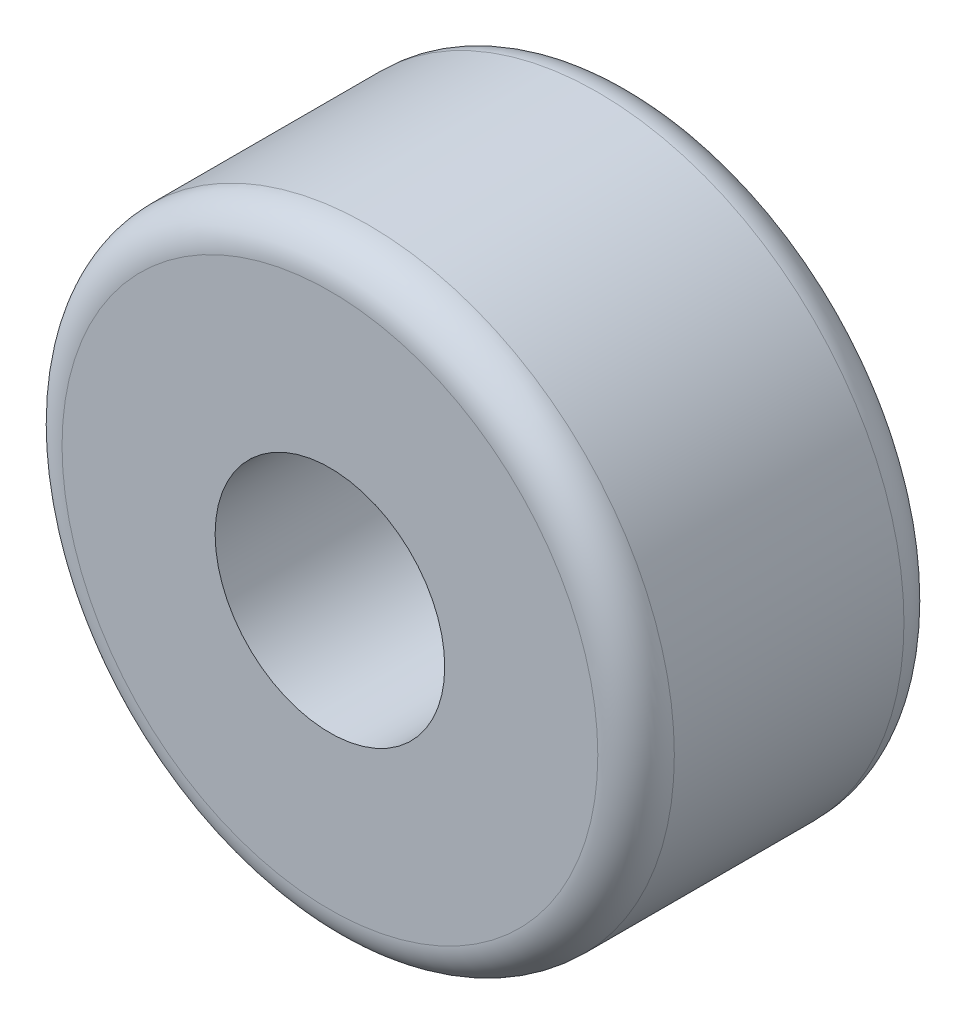
ISO-10303-21;
HEADER;
FILE_DESCRIPTION(('STEP AP214'),'2;1');
FILE_NAME('part.step','',(''),(''),'','','');
FILE_SCHEMA(('AUTOMOTIVE_DESIGN { 1 0 10303 214 1 1 1 1 }'));
ENDSEC;
DATA;
#1=APPLICATION_CONTEXT('core data for automotive mechanical design processes');
#2=APPLICATION_PROTOCOL_DEFINITION('international standard','automotive_design',2000,#1);
#3=PRODUCT_CONTEXT('',#1,'mechanical');
#4=PRODUCT('Part','Part','',(#3));
#5=PRODUCT_RELATED_PRODUCT_CATEGORY('part','',(#4));
#6=PRODUCT_DEFINITION_FORMATION('','',#4);
#7=PRODUCT_DEFINITION_CONTEXT('part definition',#1,'design');
#8=PRODUCT_DEFINITION('design','',#6,#7);
#9=PRODUCT_DEFINITION_SHAPE('','',#8);
#10=(LENGTH_UNIT() NAMED_UNIT(*) SI_UNIT(.MILLI.,.METRE.));
#11=(NAMED_UNIT(*) PLANE_ANGLE_UNIT() SI_UNIT($,.RADIAN.));
#12=(NAMED_UNIT(*) SI_UNIT($,.STERADIAN.) SOLID_ANGLE_UNIT());
#13=UNCERTAINTY_MEASURE_WITH_UNIT(LENGTH_MEASURE(1.E-05),#10,'distance_accuracy_value','');
#14=(GEOMETRIC_REPRESENTATION_CONTEXT(3) GLOBAL_UNCERTAINTY_ASSIGNED_CONTEXT((#13)) GLOBAL_UNIT_ASSIGNED_CONTEXT((#10,
#11,#12)) REPRESENTATION_CONTEXT('',''));
#15=CARTESIAN_POINT('',(0.,0.,0.));
#16=DIRECTION('',(0.,0.,1.));
#17=DIRECTION('',(1.,0.,0.));
#18=AXIS2_PLACEMENT_3D('',#15,#16,#17);
#19=CARTESIAN_POINT('',(0.028728990629815,0.0336525416927007,8.));
#20=DIRECTION('',(0.,0.,1.));
#21=DIRECTION('',(1.,0.,0.));
#22=AXIS2_PLACEMENT_3D('',#19,#20,#21);
#23=PLANE('',#22);
#24=CARTESIAN_POINT('',(0.028728990629815,0.0336525416927007,8.));
#25=DIRECTION('',(0.,0.,1.));
#26=DIRECTION('',(1.,0.,0.));
#27=AXIS2_PLACEMENT_3D('',#24,#25,#26);
#28=CIRCLE('',#27,7.);
#29=CARTESIAN_POINT('',(7.02872899062981,0.0336525416927007,8.));
#30=VERTEX_POINT('',#29);
#31=EDGE_CURVE('E10',#30,#30,#28,.T.);
#32=ORIENTED_EDGE('',*,*,#31,.T.);
#33=EDGE_LOOP('',(#32));
#34=FACE_BOUND('',#33,.T.);
#35=CARTESIAN_POINT('',(0.028728990629815,0.0336525416927007,8.));
#36=DIRECTION('',(0.,0.,1.));
#37=DIRECTION('',(1.,0.,0.));
#38=AXIS2_PLACEMENT_3D('',#35,#36,#37);
#39=CIRCLE('',#38,3.);
#40=CARTESIAN_POINT('',(3.02872899062982,0.0336525416927007,8.));
#41=VERTEX_POINT('',#40);
#42=EDGE_CURVE('E51',#41,#41,#39,.T.);
#43=ORIENTED_EDGE('',*,*,#42,.F.);
#44=EDGE_LOOP('',(#43));
#45=FACE_BOUND('',#44,.T.);
#46=ADVANCED_FACE('F31',(#34,#45),#23,.T.);
#47=CARTESIAN_POINT('',(0.028728990629815,0.0336525416927007,0.));
#48=DIRECTION('',(0.,0.,1.));
#49=DIRECTION('',(1.,0.,0.));
#50=AXIS2_PLACEMENT_3D('',#47,#48,#49);
#51=PLANE('',#50);
#52=CARTESIAN_POINT('',(0.028728990629815,0.0336525416927007,0.));
#53=DIRECTION('',(0.,0.,1.));
#54=DIRECTION('',(1.,0.,0.));
#55=AXIS2_PLACEMENT_3D('',#52,#53,#54);
#56=CIRCLE('',#55,7.);
#57=CARTESIAN_POINT('',(7.02872899062981,0.0336525416927007,0.));
#58=VERTEX_POINT('',#57);
#59=EDGE_CURVE('E38',#58,#58,#56,.F.);
#60=ORIENTED_EDGE('',*,*,#59,.T.);
#61=EDGE_LOOP('',(#60));
#62=FACE_BOUND('',#61,.T.);
#63=CARTESIAN_POINT('',(0.028728990629815,0.0336525416927007,0.));
#64=DIRECTION('',(0.,0.,1.));
#65=DIRECTION('',(1.,0.,0.));
#66=AXIS2_PLACEMENT_3D('',#63,#64,#65);
#67=CIRCLE('',#66,3.);
#68=CARTESIAN_POINT('',(3.02872899062982,0.0336525416927007,0.));
#69=VERTEX_POINT('',#68);
#70=EDGE_CURVE('E52',#69,#69,#67,.T.);
#71=ORIENTED_EDGE('',*,*,#70,.T.);
#72=EDGE_LOOP('',(#71));
#73=FACE_BOUND('',#72,.T.);
#74=ADVANCED_FACE('F62',(#62,#73),#51,.F.);
#75=CARTESIAN_POINT('',(0.028728990629815,0.0336525416927007,8.));
#76=DIRECTION('',(0.,0.,-1.));
#77=DIRECTION('',(-1.,0.,0.));
#78=AXIS2_PLACEMENT_3D('',#75,#76,#77);
#79=CYLINDRICAL_SURFACE('',#78,8.);
#80=CARTESIAN_POINT('',(0.028728990629815,0.0336525416927007,1.));
#81=DIRECTION('',(0.,0.,1.));
#82=DIRECTION('',(1.,0.,0.));
#83=AXIS2_PLACEMENT_3D('',#80,#81,#82);
#84=CIRCLE('',#83,8.);
#85=CARTESIAN_POINT('',(8.02872899062982,0.0336525416927007,1.));
#86=VERTEX_POINT('',#85);
#87=EDGE_CURVE('E42',#86,#86,#84,.T.);
#88=ORIENTED_EDGE('',*,*,#87,.T.);
#89=EDGE_LOOP('',(#88));
#90=FACE_BOUND('',#89,.T.);
#91=CARTESIAN_POINT('',(0.028728990629815,0.0336525416927007,7.));
#92=DIRECTION('',(0.,0.,1.));
#93=DIRECTION('',(1.,0.,0.));
#94=AXIS2_PLACEMENT_3D('',#91,#92,#93);
#95=CIRCLE('',#94,8.);
#96=CARTESIAN_POINT('',(8.02872899062982,0.0336525416927007,7.));
#97=VERTEX_POINT('',#96);
#98=EDGE_CURVE('E46',#97,#97,#95,.F.);
#99=ORIENTED_EDGE('',*,*,#98,.T.);
#100=EDGE_LOOP('',(#99));
#101=FACE_BOUND('',#100,.T.);
#102=ADVANCED_FACE('F67',(#90,#101),#79,.T.);
#103=CARTESIAN_POINT('',(0.028728990629815,0.0336525416927007,8.));
#104=DIRECTION('',(0.,0.,-1.));
#105=DIRECTION('',(-1.,0.,0.));
#106=AXIS2_PLACEMENT_3D('',#103,#104,#105);
#107=CYLINDRICAL_SURFACE('',#106,3.);
#108=ORIENTED_EDGE('',*,*,#42,.T.);
#109=EDGE_LOOP('',(#108));
#110=FACE_BOUND('',#109,.T.);
#111=ORIENTED_EDGE('',*,*,#70,.F.);
#112=EDGE_LOOP('',(#111));
#113=FACE_BOUND('',#112,.T.);
#114=ADVANCED_FACE('F58',(#110,#113),#107,.F.);
#115=CARTESIAN_POINT('',(0.028728990629815,0.0336525416927007,1.));
#116=DIRECTION('',(0.,0.,1.));
#117=DIRECTION('',(1.,0.,0.));
#118=AXIS2_PLACEMENT_3D('',#115,#116,#117);
#119=TOROIDAL_SURFACE('',#118,7.,1.);
#120=ORIENTED_EDGE('',*,*,#59,.F.);
#121=EDGE_LOOP('',(#120));
#122=FACE_BOUND('',#121,.T.);
#123=ORIENTED_EDGE('',*,*,#87,.F.);
#124=EDGE_LOOP('',(#123));
#125=FACE_BOUND('',#124,.T.);
#126=ADVANCED_FACE('F73',(#122,#125),#119,.T.);
#127=CARTESIAN_POINT('',(0.028728990629815,0.0336525416927007,7.));
#128=DIRECTION('',(0.,0.,1.));
#129=DIRECTION('',(1.,0.,0.));
#130=AXIS2_PLACEMENT_3D('',#127,#128,#129);
#131=TOROIDAL_SURFACE('',#130,7.,1.);
#132=ORIENTED_EDGE('',*,*,#98,.F.);
#133=EDGE_LOOP('',(#132));
#134=FACE_BOUND('',#133,.T.);
#135=ORIENTED_EDGE('',*,*,#31,.F.);
#136=EDGE_LOOP('',(#135));
#137=FACE_BOUND('',#136,.T.);
#138=ADVANCED_FACE('F33',(#134,#137),#131,.T.);
#139=CLOSED_SHELL('',(#46,#74,#102,#114,#126,#138));
#140=MANIFOLD_SOLID_BREP('B2',#139);
#141=ADVANCED_BREP_SHAPE_REPRESENTATION('',(#18,#140),#14);
#142=SHAPE_DEFINITION_REPRESENTATION(#9,#141);
ENDSEC;
END-ISO-10303-21;
